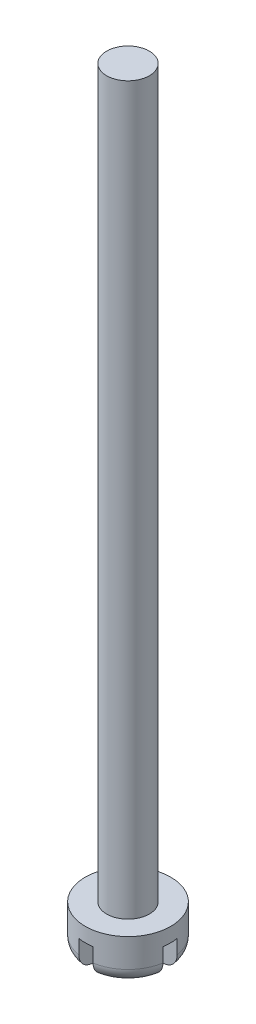
ISO-10303-21;
HEADER;
FILE_DESCRIPTION(('STEP AP214'),'2;1');
FILE_NAME('part.step','',(''),(''),'','','');
FILE_SCHEMA(('AUTOMOTIVE_DESIGN { 1 0 10303 214 1 1 1 1 }'));
ENDSEC;
DATA;
#1=APPLICATION_CONTEXT('core data for automotive mechanical design processes');
#2=APPLICATION_PROTOCOL_DEFINITION('international standard','automotive_design',2000,#1);
#3=PRODUCT_CONTEXT('',#1,'mechanical');
#4=PRODUCT('Part','Part','',(#3));
#5=PRODUCT_RELATED_PRODUCT_CATEGORY('part','',(#4));
#6=PRODUCT_DEFINITION_FORMATION('','',#4);
#7=PRODUCT_DEFINITION_CONTEXT('part definition',#1,'design');
#8=PRODUCT_DEFINITION('design','',#6,#7);
#9=PRODUCT_DEFINITION_SHAPE('','',#8);
#10=(LENGTH_UNIT() NAMED_UNIT(*) SI_UNIT(.MILLI.,.METRE.));
#11=(NAMED_UNIT(*) PLANE_ANGLE_UNIT() SI_UNIT($,.RADIAN.));
#12=(NAMED_UNIT(*) SI_UNIT($,.STERADIAN.) SOLID_ANGLE_UNIT());
#13=UNCERTAINTY_MEASURE_WITH_UNIT(LENGTH_MEASURE(1.E-05),#10,'distance_accuracy_value','');
#14=(GEOMETRIC_REPRESENTATION_CONTEXT(3) GLOBAL_UNCERTAINTY_ASSIGNED_CONTEXT((#13)) GLOBAL_UNIT_ASSIGNED_CONTEXT((#10,
#11,#12)) REPRESENTATION_CONTEXT('',''));
#15=CARTESIAN_POINT('',(0.,0.,0.));
#16=DIRECTION('',(0.,0.,1.));
#17=DIRECTION('',(1.,0.,0.));
#18=AXIS2_PLACEMENT_3D('',#15,#16,#17);
#19=CARTESIAN_POINT('',(-17.0692710791062,0.,10.6565062538066));
#20=DIRECTION('',(0.,-1.,0.));
#21=DIRECTION('',(0.,0.,-1.));
#22=AXIS2_PLACEMENT_3D('',#19,#20,#21);
#23=CYLINDRICAL_SURFACE('',#22,1.5);
#24=DIRECTION('',(0.,-1.,0.));
#25=VECTOR('',#24,1.);
#26=CARTESIAN_POINT('',(-16.8192710791062,-0.5,12.1355261995815));
#27=LINE('',#26,#25);
#28=CARTESIAN_POINT('',(-16.8192710791062,-0.5,12.1355261995815));
#29=VERTEX_POINT('',#28);
#30=CARTESIAN_POINT('',(-16.8192710791062,-1.,12.1355261995815));
#31=VERTEX_POINT('',#30);
#32=EDGE_CURVE('E236',#29,#31,#27,.T.);
#33=ORIENTED_EDGE('',*,*,#32,.T.);
#34=CARTESIAN_POINT('',(-17.0692710791062,-1.,10.6565062538066));
#35=DIRECTION('',(0.,-1.,0.));
#36=DIRECTION('',(0.,0.,-1.));
#37=AXIS2_PLACEMENT_3D('',#34,#35,#36);
#38=CIRCLE('',#37,1.5);
#39=CARTESIAN_POINT('',(-15.5902511333313,-1.,10.9065062538066));
#40=VERTEX_POINT('',#39);
#41=EDGE_CURVE('E288',#31,#40,#38,.F.);
#42=ORIENTED_EDGE('',*,*,#41,.T.);
#43=DIRECTION('',(0.,-1.,0.));
#44=VECTOR('',#43,1.);
#45=CARTESIAN_POINT('',(-15.5902511333313,-0.5,10.9065062538066));
#46=LINE('',#45,#44);
#47=CARTESIAN_POINT('',(-15.5902511333313,-0.5,10.9065062538066));
#48=VERTEX_POINT('',#47);
#49=EDGE_CURVE('E242',#48,#40,#46,.T.);
#50=ORIENTED_EDGE('',*,*,#49,.F.);
#51=CARTESIAN_POINT('',(-17.0692710791062,-0.5,10.6565062538066));
#52=DIRECTION('',(0.,-1.,0.));
#53=DIRECTION('',(0.,0.,-1.));
#54=AXIS2_PLACEMENT_3D('',#51,#52,#53);
#55=CIRCLE('',#54,1.5);
#56=CARTESIAN_POINT('',(-15.5902511333313,-0.5,10.4065062538066));
#57=VERTEX_POINT('',#56);
#58=EDGE_CURVE('E173',#57,#48,#55,.T.);
#59=ORIENTED_EDGE('',*,*,#58,.F.);
#60=DIRECTION('',(0.,-1.,0.));
#61=VECTOR('',#60,1.);
#62=CARTESIAN_POINT('',(-15.5902511333313,-0.5,10.4065062538066));
#63=LINE('',#62,#61);
#64=CARTESIAN_POINT('',(-15.5902511333313,-1.,10.4065062538066));
#65=VERTEX_POINT('',#64);
#66=EDGE_CURVE('E157',#57,#65,#63,.T.);
#67=ORIENTED_EDGE('',*,*,#66,.T.);
#68=CARTESIAN_POINT('',(-17.0692710791062,-1.,10.6565062538066));
#69=DIRECTION('',(0.,-1.,0.));
#70=DIRECTION('',(0.,0.,-1.));
#71=AXIS2_PLACEMENT_3D('',#68,#69,#70);
#72=CIRCLE('',#71,1.5);
#73=CARTESIAN_POINT('',(-16.8192710791062,-1.,9.17748630803172));
#74=VERTEX_POINT('',#73);
#75=EDGE_CURVE('E264',#65,#74,#72,.F.);
#76=ORIENTED_EDGE('',*,*,#75,.T.);
#77=DIRECTION('',(0.,-1.,0.));
#78=VECTOR('',#77,1.);
#79=CARTESIAN_POINT('',(-16.8192710791062,-0.5,9.17748630803172));
#80=LINE('',#79,#78);
#81=CARTESIAN_POINT('',(-16.8192710791062,-0.5,9.17748630803172));
#82=VERTEX_POINT('',#81);
#83=EDGE_CURVE('E215',#82,#74,#80,.T.);
#84=ORIENTED_EDGE('',*,*,#83,.F.);
#85=CARTESIAN_POINT('',(-17.0692710791062,-0.5,10.6565062538066));
#86=DIRECTION('',(0.,-1.,0.));
#87=DIRECTION('',(0.,0.,-1.));
#88=AXIS2_PLACEMENT_3D('',#85,#86,#87);
#89=CIRCLE('',#88,1.5);
#90=CARTESIAN_POINT('',(-17.3192710791062,-0.5,9.17748630803172));
#91=VERTEX_POINT('',#90);
#92=EDGE_CURVE('E158',#91,#82,#89,.T.);
#93=ORIENTED_EDGE('',*,*,#92,.F.);
#94=DIRECTION('',(0.,-1.,0.));
#95=VECTOR('',#94,1.);
#96=CARTESIAN_POINT('',(-17.3192710791062,-0.5,9.17748630803172));
#97=LINE('',#96,#95);
#98=CARTESIAN_POINT('',(-17.3192710791062,-1.,9.17748630803172));
#99=VERTEX_POINT('',#98);
#100=EDGE_CURVE('E218',#91,#99,#97,.T.);
#101=ORIENTED_EDGE('',*,*,#100,.T.);
#102=CARTESIAN_POINT('',(-17.0692710791062,-1.,10.6565062538066));
#103=DIRECTION('',(0.,-1.,0.));
#104=DIRECTION('',(0.,0.,-1.));
#105=AXIS2_PLACEMENT_3D('',#102,#103,#104);
#106=CIRCLE('',#105,1.5);
#107=CARTESIAN_POINT('',(-18.5482910248811,-1.,10.4065062538066));
#108=VERTEX_POINT('',#107);
#109=EDGE_CURVE('E356',#99,#108,#106,.F.);
#110=ORIENTED_EDGE('',*,*,#109,.T.);
#111=DIRECTION('',(0.,-1.,0.));
#112=VECTOR('',#111,1.);
#113=CARTESIAN_POINT('',(-18.5482910248811,-0.5,10.4065062538066));
#114=LINE('',#113,#112);
#115=CARTESIAN_POINT('',(-18.5482910248811,-0.5,10.4065062538066));
#116=VERTEX_POINT('',#115);
#117=EDGE_CURVE('E224',#116,#108,#114,.T.);
#118=ORIENTED_EDGE('',*,*,#117,.F.);
#119=CARTESIAN_POINT('',(-17.0692710791062,-0.5,10.6565062538066));
#120=DIRECTION('',(0.,-1.,0.));
#121=DIRECTION('',(0.,0.,-1.));
#122=AXIS2_PLACEMENT_3D('',#119,#120,#121);
#123=CIRCLE('',#122,1.5);
#124=CARTESIAN_POINT('',(-18.5482910248811,-0.5,10.9065062538066));
#125=VERTEX_POINT('',#124);
#126=EDGE_CURVE('E189',#125,#116,#123,.T.);
#127=ORIENTED_EDGE('',*,*,#126,.F.);
#128=DIRECTION('',(0.,-1.,0.));
#129=VECTOR('',#128,1.);
#130=CARTESIAN_POINT('',(-18.5482910248811,-0.5,10.9065062538066));
#131=LINE('',#130,#129);
#132=CARTESIAN_POINT('',(-18.5482910248811,-1.,10.9065062538066));
#133=VERTEX_POINT('',#132);
#134=EDGE_CURVE('E227',#125,#133,#131,.T.);
#135=ORIENTED_EDGE('',*,*,#134,.T.);
#136=CARTESIAN_POINT('',(-17.0692710791062,-1.,10.6565062538066));
#137=DIRECTION('',(0.,-1.,0.));
#138=DIRECTION('',(0.,0.,-1.));
#139=AXIS2_PLACEMENT_3D('',#136,#137,#138);
#140=CIRCLE('',#139,1.5);
#141=CARTESIAN_POINT('',(-17.3192710791062,-1.,12.1355261995815));
#142=VERTEX_POINT('',#141);
#143=EDGE_CURVE('E358',#133,#142,#140,.F.);
#144=ORIENTED_EDGE('',*,*,#143,.T.);
#145=DIRECTION('',(0.,-1.,0.));
#146=VECTOR('',#145,1.);
#147=CARTESIAN_POINT('',(-17.3192710791062,-0.5,12.1355261995815));
#148=LINE('',#147,#146);
#149=CARTESIAN_POINT('',(-17.3192710791062,-0.5,12.1355261995815));
#150=VERTEX_POINT('',#149);
#151=EDGE_CURVE('E233',#150,#142,#148,.T.);
#152=ORIENTED_EDGE('',*,*,#151,.F.);
#153=CARTESIAN_POINT('',(-17.0692710791062,-0.5,10.6565062538066));
#154=DIRECTION('',(0.,-1.,0.));
#155=DIRECTION('',(0.,0.,-1.));
#156=AXIS2_PLACEMENT_3D('',#153,#154,#155);
#157=CIRCLE('',#156,1.5);
#158=EDGE_CURVE('E181',#29,#150,#157,.T.);
#159=ORIENTED_EDGE('',*,*,#158,.F.);
#160=EDGE_LOOP('',(#33,#42,#50,#59,#67,#76,#84,#93,#101,#110,#118,#127,#135,#144,#152,#159));
#161=FACE_BOUND('',#160,.T.);
#162=CARTESIAN_POINT('',(-17.0692710791062,0.,10.6565062538066));
#163=DIRECTION('',(0.,-1.,0.));
#164=DIRECTION('',(0.,0.,-1.));
#165=AXIS2_PLACEMENT_3D('',#162,#163,#164);
#166=CIRCLE('',#165,1.5);
#167=CARTESIAN_POINT('',(-17.0692710791062,0.,9.15650625380663));
#168=VERTEX_POINT('',#167);
#169=EDGE_CURVE('E248',#168,#168,#166,.T.);
#170=ORIENTED_EDGE('',*,*,#169,.T.);
#171=EDGE_LOOP('',(#170));
#172=FACE_BOUND('',#171,.T.);
#173=ADVANCED_FACE('F32',(#161,#172),#23,.T.);
#174=CARTESIAN_POINT('',(-17.0692710791062,-1.5,10.6565062538066));
#175=DIRECTION('',(0.,-1.,0.));
#176=DIRECTION('',(0.,0.,-1.));
#177=AXIS2_PLACEMENT_3D('',#174,#175,#176);
#178=PLANE('',#177);
#179=DIRECTION('',(0.,0.,-1.));
#180=VECTOR('',#179,1.);
#181=CARTESIAN_POINT('',(-17.3192710791062,-1.5,0.));
#182=LINE('',#181,#180);
#183=CARTESIAN_POINT('',(-17.3192710791062,-1.5,11.6247520903585));
#184=VERTEX_POINT('',#183);
#185=CARTESIAN_POINT('',(-17.3192710791062,-1.5,10.9065062538066));
#186=VERTEX_POINT('',#185);
#187=EDGE_CURVE('E206',#184,#186,#182,.T.);
#188=ORIENTED_EDGE('',*,*,#187,.F.);
#189=CARTESIAN_POINT('',(-17.0692710791062,-1.5,10.6565062538066));
#190=DIRECTION('',(0.,-1.,0.));
#191=DIRECTION('',(0.,0.,-1.));
#192=AXIS2_PLACEMENT_3D('',#189,#190,#191);
#193=CIRCLE('',#192,1.);
#194=CARTESIAN_POINT('',(-18.0375169156581,-1.5,10.9065062538066));
#195=VERTEX_POINT('',#194);
#196=EDGE_CURVE('E287',#184,#195,#193,.T.);
#197=ORIENTED_EDGE('',*,*,#196,.T.);
#198=DIRECTION('',(1.,0.,0.));
#199=VECTOR('',#198,1.);
#200=CARTESIAN_POINT('',(0.,-1.5,10.9065062538066));
#201=LINE('',#200,#199);
#202=EDGE_CURVE('E208',#195,#186,#201,.T.);
#203=ORIENTED_EDGE('',*,*,#202,.T.);
#204=EDGE_LOOP('',(#188,#197,#203));
#205=FACE_BOUND('',#204,.T.);
#206=ADVANCED_FACE('F371',(#205),#178,.T.);
#207=DIRECTION('',(1.,0.,0.));
#208=VECTOR('',#207,1.);
#209=CARTESIAN_POINT('',(0.,-1.5,10.9065062538066));
#210=LINE('',#209,#208);
#211=CARTESIAN_POINT('',(-16.8192710791062,-1.5,10.9065062538066));
#212=VERTEX_POINT('',#211);
#213=CARTESIAN_POINT('',(-16.1010252425543,-1.5,10.9065062538066));
#214=VERTEX_POINT('',#213);
#215=EDGE_CURVE('E201',#212,#214,#210,.T.);
#216=ORIENTED_EDGE('',*,*,#215,.T.);
#217=CARTESIAN_POINT('',(-17.0692710791062,-1.5,10.6565062538066));
#218=DIRECTION('',(0.,-1.,0.));
#219=DIRECTION('',(0.,0.,-1.));
#220=AXIS2_PLACEMENT_3D('',#217,#218,#219);
#221=CIRCLE('',#220,1.);
#222=CARTESIAN_POINT('',(-16.8192710791062,-1.5,11.6247520903585));
#223=VERTEX_POINT('',#222);
#224=EDGE_CURVE('E254',#214,#223,#221,.T.);
#225=ORIENTED_EDGE('',*,*,#224,.T.);
#226=DIRECTION('',(0.,0.,-1.));
#227=VECTOR('',#226,1.);
#228=CARTESIAN_POINT('',(-16.8192710791062,-1.5,0.));
#229=LINE('',#228,#227);
#230=EDGE_CURVE('E204',#223,#212,#229,.T.);
#231=ORIENTED_EDGE('',*,*,#230,.T.);
#232=EDGE_LOOP('',(#216,#225,#231));
#233=FACE_BOUND('',#232,.T.);
#234=ADVANCED_FACE('F363',(#233),#178,.T.);
#235=DIRECTION('',(0.,0.,-1.));
#236=VECTOR('',#235,1.);
#237=CARTESIAN_POINT('',(-16.8192710791062,-1.5,0.));
#238=LINE('',#237,#236);
#239=CARTESIAN_POINT('',(-16.8192710791062,-1.5,10.4065062538066));
#240=VERTEX_POINT('',#239);
#241=CARTESIAN_POINT('',(-16.8192710791062,-1.5,9.68826041725477));
#242=VERTEX_POINT('',#241);
#243=EDGE_CURVE('E152',#240,#242,#238,.T.);
#244=ORIENTED_EDGE('',*,*,#243,.T.);
#245=CARTESIAN_POINT('',(-17.0692710791062,-1.5,10.6565062538066));
#246=DIRECTION('',(0.,-1.,0.));
#247=DIRECTION('',(0.,0.,-1.));
#248=AXIS2_PLACEMENT_3D('',#245,#246,#247);
#249=CIRCLE('',#248,1.);
#250=CARTESIAN_POINT('',(-16.1010252425543,-1.5,10.4065062538066));
#251=VERTEX_POINT('',#250);
#252=EDGE_CURVE('E304',#242,#251,#249,.T.);
#253=ORIENTED_EDGE('',*,*,#252,.T.);
#254=DIRECTION('',(1.,0.,0.));
#255=VECTOR('',#254,1.);
#256=CARTESIAN_POINT('',(0.,-1.5,10.4065062538066));
#257=LINE('',#256,#255);
#258=EDGE_CURVE('E199',#240,#251,#257,.T.);
#259=ORIENTED_EDGE('',*,*,#258,.F.);
#260=EDGE_LOOP('',(#244,#253,#259));
#261=FACE_BOUND('',#260,.T.);
#262=ADVANCED_FACE('F360',(#261),#178,.T.);
#263=CARTESIAN_POINT('',(-17.0692710791062,0.,10.6565062538066));
#264=DIRECTION('',(0.,-1.,0.));
#265=DIRECTION('',(0.,0.,-1.));
#266=AXIS2_PLACEMENT_3D('',#263,#264,#265);
#267=PLANE('',#266);
#268=CARTESIAN_POINT('',(-17.0692710791062,0.,10.6565062538066));
#269=DIRECTION('',(0.,-1.,0.));
#270=DIRECTION('',(0.,0.,-1.));
#271=AXIS2_PLACEMENT_3D('',#268,#269,#270);
#272=CIRCLE('',#271,0.750000000000002);
#273=CARTESIAN_POINT('',(-17.0692710791062,0.,9.90650625380663));
#274=VERTEX_POINT('',#273);
#275=EDGE_CURVE('E251',#274,#274,#272,.F.);
#276=ORIENTED_EDGE('',*,*,#275,.F.);
#277=EDGE_LOOP('',(#276));
#278=FACE_BOUND('',#277,.T.);
#279=ORIENTED_EDGE('',*,*,#169,.F.);
#280=EDGE_LOOP('',(#279));
#281=FACE_BOUND('',#280,.T.);
#282=ADVANCED_FACE('F362',(#278,#281),#267,.F.);
#283=DIRECTION('',(1.,0.,0.));
#284=VECTOR('',#283,1.);
#285=CARTESIAN_POINT('',(0.,-1.5,10.4065062538066));
#286=LINE('',#285,#284);
#287=CARTESIAN_POINT('',(-18.0375169156581,-1.5,10.4065062538066));
#288=VERTEX_POINT('',#287);
#289=CARTESIAN_POINT('',(-17.3192710791062,-1.5,10.4065062538066));
#290=VERTEX_POINT('',#289);
#291=EDGE_CURVE('E211',#288,#290,#286,.T.);
#292=ORIENTED_EDGE('',*,*,#291,.F.);
#293=CARTESIAN_POINT('',(-17.0692710791062,-1.5,10.6565062538066));
#294=DIRECTION('',(0.,-1.,0.));
#295=DIRECTION('',(0.,0.,-1.));
#296=AXIS2_PLACEMENT_3D('',#293,#294,#295);
#297=CIRCLE('',#296,1.);
#298=CARTESIAN_POINT('',(-17.3192710791062,-1.5,9.68826041725477));
#299=VERTEX_POINT('',#298);
#300=EDGE_CURVE('E343',#288,#299,#297,.T.);
#301=ORIENTED_EDGE('',*,*,#300,.T.);
#302=DIRECTION('',(0.,0.,-1.));
#303=VECTOR('',#302,1.);
#304=CARTESIAN_POINT('',(-17.3192710791062,-1.5,0.));
#305=LINE('',#304,#303);
#306=EDGE_CURVE('E169',#290,#299,#305,.T.);
#307=ORIENTED_EDGE('',*,*,#306,.F.);
#308=EDGE_LOOP('',(#292,#301,#307));
#309=FACE_BOUND('',#308,.T.);
#310=ADVANCED_FACE('F364',(#309),#178,.T.);
#311=CARTESIAN_POINT('',(-17.0692710791062,25.5,10.6565062538066));
#312=DIRECTION('',(0.,-1.,0.));
#313=DIRECTION('',(0.,0.,-1.));
#314=AXIS2_PLACEMENT_3D('',#311,#312,#313);
#315=CYLINDRICAL_SURFACE('',#314,0.750000000000002);
#316=CARTESIAN_POINT('',(-17.0692710791062,25.5,10.6565062538066));
#317=DIRECTION('',(0.,1.,0.));
#318=DIRECTION('',(0.,0.,1.));
#319=AXIS2_PLACEMENT_3D('',#316,#317,#318);
#320=CIRCLE('',#319,0.750000000000002);
#321=CARTESIAN_POINT('',(-17.0692710791062,25.5,11.4065062538066));
#322=VERTEX_POINT('',#321);
#323=EDGE_CURVE('E217',#322,#322,#320,.T.);
#324=ORIENTED_EDGE('',*,*,#323,.F.);
#325=EDGE_LOOP('',(#324));
#326=FACE_BOUND('',#325,.T.);
#327=ORIENTED_EDGE('',*,*,#275,.T.);
#328=EDGE_LOOP('',(#327));
#329=FACE_BOUND('',#328,.T.);
#330=ADVANCED_FACE('F374',(#326,#329),#315,.T.);
#331=CARTESIAN_POINT('',(-17.0692710791062,25.5,10.6565062538066));
#332=DIRECTION('',(0.,1.,0.));
#333=DIRECTION('',(0.,0.,1.));
#334=AXIS2_PLACEMENT_3D('',#331,#332,#333);
#335=PLANE('',#334);
#336=ORIENTED_EDGE('',*,*,#323,.T.);
#337=EDGE_LOOP('',(#336));
#338=FACE_BOUND('',#337,.T.);
#339=ADVANCED_FACE('F430',(#338),#335,.T.);
#340=CARTESIAN_POINT('',(-16.8192710791062,-0.5,0.));
#341=DIRECTION('',(-1.,0.,0.));
#342=DIRECTION('',(0.,0.,1.));
#343=AXIS2_PLACEMENT_3D('',#340,#341,#342);
#344=PLANE('',#343);
#345=ORIENTED_EDGE('',*,*,#83,.T.);
#346=CARTESIAN_POINT('',(-16.8192710791062,-1.,9.17748630803172));
#347=CARTESIAN_POINT('',(-16.8192710791062,-1.02781374861587,9.17746133600351));
#348=CARTESIAN_POINT('',(-16.8192710791062,-1.05561878275942,9.17983847976104));
#349=CARTESIAN_POINT('',(-16.8192710791062,-1.11040918462667,9.1892108925483));
#350=CARTESIAN_POINT('',(-16.8192710791062,-1.1373954194116,9.19620108441866));
#351=CARTESIAN_POINT('',(-16.8192710791062,-1.18982056987484,9.21461777101079));
#352=CARTESIAN_POINT('',(-16.8192710791062,-1.21525888685985,9.22604596977785));
#353=CARTESIAN_POINT('',(-16.8192710791062,-1.26386535613692,9.25298906197642));
#354=CARTESIAN_POINT('',(-16.8192710791062,-1.28703370184331,9.26850360681203));
#355=CARTESIAN_POINT('',(-16.8192710791062,-1.33057114447973,9.30324668170601));
#356=CARTESIAN_POINT('',(-16.8192710791062,-1.35092667525741,9.32249220397226));
#357=CARTESIAN_POINT('',(-16.8192710791062,-1.38816977540175,9.36409023933414));
#358=CARTESIAN_POINT('',(-16.8192710791062,-1.40505685896336,9.38644318693436));
#359=CARTESIAN_POINT('',(-16.8192710791062,-1.43513150557888,9.43392757817237));
#360=CARTESIAN_POINT('',(-16.8192710791062,-1.44826694634839,9.45909198573012));
#361=CARTESIAN_POINT('',(-16.8192710791062,-1.47022215105242,9.51123766077089));
#362=CARTESIAN_POINT('',(-16.8192710791062,-1.47904248018834,9.53821868978248));
#363=CARTESIAN_POINT('',(-16.8192710791062,-1.49041247750673,9.58578860221363));
#364=CARTESIAN_POINT('',(-16.8192710791062,-1.49401269448298,9.60613387865773));
#365=CARTESIAN_POINT('',(-16.8192710791062,-1.49880661116601,9.64707171207831));
#366=CARTESIAN_POINT('',(-16.8192710791062,-1.50000434824293,9.66766379559684));
#367=CARTESIAN_POINT('',(-16.8192710791062,-1.5,9.68826041725477));
#368=B_SPLINE_CURVE_WITH_KNOTS('',3,(#346,#347,#348,#349,#350,#351,#352,#353,#354,#355,#356,
#357,#358,#359,#360,#361,#362,#363,#364,#365,#366,#367),.UNSPECIFIED.,.F.,.F.,(4,2,2,2,2,2,2,2,
2,2,4),(0.,0.0833270481001731,0.166562538363734,0.249830019904457,0.33309040040545,
0.416739286173483,0.50039988017215,0.585171778757121,0.669932570785234,0.731781346069536,
0.793526097046583),.UNSPECIFIED.);
#369=EDGE_CURVE('E11',#74,#242,#368,.T.);
#370=ORIENTED_EDGE('',*,*,#369,.T.);
#371=ORIENTED_EDGE('',*,*,#243,.F.);
#372=DIRECTION('',(0.,-1.,0.));
#373=VECTOR('',#372,1.);
#374=CARTESIAN_POINT('',(-16.8192710791062,-0.5,10.4065062538066));
#375=LINE('',#374,#373);
#376=CARTESIAN_POINT('',(-16.8192710791062,-0.5,10.4065062538066));
#377=VERTEX_POINT('',#376);
#378=EDGE_CURVE('E147',#377,#240,#375,.T.);
#379=ORIENTED_EDGE('',*,*,#378,.F.);
#380=DIRECTION('',(0.,0.,-1.));
#381=VECTOR('',#380,1.);
#382=CARTESIAN_POINT('',(-16.8192710791062,-0.5,0.));
#383=LINE('',#382,#381);
#384=EDGE_CURVE('E150',#377,#82,#383,.T.);
#385=ORIENTED_EDGE('',*,*,#384,.T.);
#386=EDGE_LOOP('',(#345,#370,#371,#379,#385));
#387=FACE_BOUND('',#386,.T.);
#388=ADVANCED_FACE('F149',(#387),#344,.T.);
#389=CARTESIAN_POINT('',(-17.3192710791062,-0.5,0.));
#390=DIRECTION('',(-1.,0.,0.));
#391=DIRECTION('',(0.,0.,1.));
#392=AXIS2_PLACEMENT_3D('',#389,#390,#391);
#393=PLANE('',#392);
#394=ORIENTED_EDGE('',*,*,#306,.T.);
#395=CARTESIAN_POINT('',(-17.3192710791062,-1.5,9.68826041725477));
#396=CARTESIAN_POINT('',(-17.3192710791062,-1.50002666200087,9.65897250436663));
#397=CARTESIAN_POINT('',(-17.3192710791062,-1.49758845506674,9.62967764388912));
#398=CARTESIAN_POINT('',(-17.3192710791062,-1.48788360445574,9.57189097864754));
#399=CARTESIAN_POINT('',(-17.3192710791062,-1.48061552591558,9.54339941515062));
#400=CARTESIAN_POINT('',(-17.3192710791062,-1.46134053487843,9.48802077149023));
#401=CARTESIAN_POINT('',(-17.3192710791062,-1.44932782550184,9.46113570053676));
#402=CARTESIAN_POINT('',(-17.3192710791062,-1.42087192496174,9.40983897701042));
#403=CARTESIAN_POINT('',(-17.3192710791062,-1.40443129451288,9.38542590604611));
#404=CARTESIAN_POINT('',(-17.3192710791062,-1.36794604771057,9.34029255444446));
#405=CARTESIAN_POINT('',(-17.3192710791062,-1.34798298041415,9.31950635522899));
#406=CARTESIAN_POINT('',(-17.3192710791062,-1.30478294123163,9.28165524835625));
#407=CARTESIAN_POINT('',(-17.3192710791062,-1.28154528638489,9.26459111888465));
#408=CARTESIAN_POINT('',(-17.3192710791062,-1.2329470389595,9.23501091306684));
#409=CARTESIAN_POINT('',(-17.3192710791062,-1.20763533281553,9.22241437406539));
#410=CARTESIAN_POINT('',(-17.3192710791062,-1.15524769940566,9.20171345161622));
#411=CARTESIAN_POINT('',(-17.3192710791062,-1.12817325689023,9.19360534090705));
#412=CARTESIAN_POINT('',(-17.3192710791062,-1.08407627432165,9.1844126490211));
#413=CARTESIAN_POINT('',(-17.3192710791062,-1.06735425967475,9.18181645317084));
#414=CARTESIAN_POINT('',(-17.3192710791062,-1.03375738887886,9.17835390235473));
#415=CARTESIAN_POINT('',(-17.3192710791062,-1.01688279851855,9.17748496778812));
#416=CARTESIAN_POINT('',(-17.3192710791062,-1.,9.17748630803172));
#417=B_SPLINE_CURVE_WITH_KNOTS('',3,(#395,#396,#397,#398,#399,#400,#401,#402,#403,#404,#405,
#406,#407,#408,#409,#410,#411,#412,#413,#414,#415,#416),.UNSPECIFIED.,.F.,.F.,(4,2,2,2,2,2,2,2,
2,2,4),(0.,0.0877728479485707,0.175571783210265,0.26347832265338,0.351334133549883,
0.437373340804232,0.523430519360222,0.607847980617785,0.692195234723126,0.742880955230151,
0.793490921446687),.UNSPECIFIED.);
#418=EDGE_CURVE('E312',#299,#99,#417,.T.);
#419=ORIENTED_EDGE('',*,*,#418,.T.);
#420=ORIENTED_EDGE('',*,*,#100,.F.);
#421=DIRECTION('',(0.,0.,-1.));
#422=VECTOR('',#421,1.);
#423=CARTESIAN_POINT('',(-17.3192710791062,-0.5,0.));
#424=LINE('',#423,#422);
#425=CARTESIAN_POINT('',(-17.3192710791062,-0.5,10.4065062538066));
#426=VERTEX_POINT('',#425);
#427=EDGE_CURVE('E195',#426,#91,#424,.T.);
#428=ORIENTED_EDGE('',*,*,#427,.F.);
#429=DIRECTION('',(0.,-1.,0.));
#430=VECTOR('',#429,1.);
#431=CARTESIAN_POINT('',(-17.3192710791062,-0.5,10.4065062538066));
#432=LINE('',#431,#430);
#433=EDGE_CURVE('E221',#426,#290,#432,.T.);
#434=ORIENTED_EDGE('',*,*,#433,.T.);
#435=EDGE_LOOP('',(#394,#419,#420,#428,#434));
#436=FACE_BOUND('',#435,.T.);
#437=ADVANCED_FACE('F325',(#436),#393,.F.);
#438=CARTESIAN_POINT('',(0.,-0.5,10.4065062538066));
#439=DIRECTION('',(0.,0.,-1.));
#440=DIRECTION('',(-1.,0.,0.));
#441=AXIS2_PLACEMENT_3D('',#438,#439,#440);
#442=PLANE('',#441);
#443=ORIENTED_EDGE('',*,*,#117,.T.);
#444=CARTESIAN_POINT('',(-18.5482910248811,-1.,10.4065062538066));
#445=CARTESIAN_POINT('',(-18.5483159969093,-1.02781374861587,10.4065062538066));
#446=CARTESIAN_POINT('',(-18.5459388531518,-1.05561878275942,10.4065062538066));
#447=CARTESIAN_POINT('',(-18.5365664403645,-1.11040918462667,10.4065062538066));
#448=CARTESIAN_POINT('',(-18.5295762484942,-1.1373954194116,10.4065062538066));
#449=CARTESIAN_POINT('',(-18.511159561902,-1.18982056987484,10.4065062538066));
#450=CARTESIAN_POINT('',(-18.499731363135,-1.21525888685985,10.4065062538066));
#451=CARTESIAN_POINT('',(-18.4727882709364,-1.26386535613692,10.4065062538066));
#452=CARTESIAN_POINT('',(-18.4572737261008,-1.28703370184331,10.4065062538066));
#453=CARTESIAN_POINT('',(-18.4225306512068,-1.33057114447973,10.4065062538066));
#454=CARTESIAN_POINT('',(-18.4032851289406,-1.35092667525741,10.4065062538066));
#455=CARTESIAN_POINT('',(-18.3616870935787,-1.38816977540175,10.4065062538066));
#456=CARTESIAN_POINT('',(-18.3393341459785,-1.40505685896336,10.4065062538066));
#457=CARTESIAN_POINT('',(-18.2918497547405,-1.43513150557888,10.4065062538066));
#458=CARTESIAN_POINT('',(-18.2666853471827,-1.44826694634839,10.4065062538066));
#459=CARTESIAN_POINT('',(-18.2145396721419,-1.47022215105242,10.4065062538066));
#460=CARTESIAN_POINT('',(-18.1875586431304,-1.47904248018834,10.4065062538066));
#461=CARTESIAN_POINT('',(-18.1399887306992,-1.49041247750673,10.4065062538066));
#462=CARTESIAN_POINT('',(-18.1196434542551,-1.49401269448297,10.4065062538066));
#463=CARTESIAN_POINT('',(-18.0787056208345,-1.49880661116601,10.4065062538066));
#464=CARTESIAN_POINT('',(-18.058113537316,-1.50000434824293,10.4065062538066));
#465=CARTESIAN_POINT('',(-18.0375169156581,-1.5,10.4065062538066));
#466=B_SPLINE_CURVE_WITH_KNOTS('',3,(#444,#445,#446,#447,#448,#449,#450,#451,#452,#453,#454,
#455,#456,#457,#458,#459,#460,#461,#462,#463,#464,#465),.UNSPECIFIED.,.F.,.F.,(4,2,2,2,2,2,2,2,
2,2,4),(0.,0.0833270481001729,0.166562538363734,0.249830019904458,0.333090400405452,
0.416739286173481,0.500399880172148,0.585171778757119,0.669932570785237,0.731781346069534,
0.793526097046581),.UNSPECIFIED.);
#467=EDGE_CURVE('E306',#108,#288,#466,.T.);
#468=ORIENTED_EDGE('',*,*,#467,.T.);
#469=ORIENTED_EDGE('',*,*,#291,.T.);
#470=ORIENTED_EDGE('',*,*,#433,.F.);
#471=DIRECTION('',(1.,0.,0.));
#472=VECTOR('',#471,1.);
#473=CARTESIAN_POINT('',(0.,-0.5,10.4065062538066));
#474=LINE('',#473,#472);
#475=EDGE_CURVE('E192',#116,#426,#474,.T.);
#476=ORIENTED_EDGE('',*,*,#475,.F.);
#477=EDGE_LOOP('',(#443,#468,#469,#470,#476));
#478=FACE_BOUND('',#477,.T.);
#479=ADVANCED_FACE('F320',(#478),#442,.F.);
#480=CARTESIAN_POINT('',(0.,-0.5,10.9065062538066));
#481=DIRECTION('',(0.,0.,-1.));
#482=DIRECTION('',(-1.,0.,0.));
#483=AXIS2_PLACEMENT_3D('',#480,#481,#482);
#484=PLANE('',#483);
#485=ORIENTED_EDGE('',*,*,#202,.F.);
#486=CARTESIAN_POINT('',(-18.0375169156581,-1.5,10.9065062538066));
#487=CARTESIAN_POINT('',(-18.0668048285462,-1.50002666200086,10.9065062538066));
#488=CARTESIAN_POINT('',(-18.0960996890237,-1.49758845506674,10.9065062538066));
#489=CARTESIAN_POINT('',(-18.1538863542653,-1.48788360445574,10.9065062538066));
#490=CARTESIAN_POINT('',(-18.1823779177622,-1.48061552591558,10.9065062538066));
#491=CARTESIAN_POINT('',(-18.2377565614226,-1.46134053487843,10.9065062538066));
#492=CARTESIAN_POINT('',(-18.2646416323761,-1.44932782550184,10.9065062538066));
#493=CARTESIAN_POINT('',(-18.3159383559024,-1.42087192496174,10.9065062538066));
#494=CARTESIAN_POINT('',(-18.3403514268667,-1.40443129451287,10.9065062538066));
#495=CARTESIAN_POINT('',(-18.3854847784684,-1.36794604771057,10.9065062538066));
#496=CARTESIAN_POINT('',(-18.4062709776838,-1.34798298041415,10.9065062538066));
#497=CARTESIAN_POINT('',(-18.4441220845566,-1.30478294123163,10.9065062538066));
#498=CARTESIAN_POINT('',(-18.4611862140282,-1.28154528638489,10.9065062538066));
#499=CARTESIAN_POINT('',(-18.490766419846,-1.2329470389595,10.9065062538066));
#500=CARTESIAN_POINT('',(-18.5033629588474,-1.20763533281552,10.9065062538066));
#501=CARTESIAN_POINT('',(-18.5240638812966,-1.15524769940566,10.9065062538066));
#502=CARTESIAN_POINT('',(-18.5321719920058,-1.12817325689023,10.9065062538066));
#503=CARTESIAN_POINT('',(-18.5413646838917,-1.08407627432165,10.9065062538066));
#504=CARTESIAN_POINT('',(-18.543960879742,-1.06735425967475,10.9065062538066));
#505=CARTESIAN_POINT('',(-18.5474234305581,-1.03375738887886,10.9065062538066));
#506=CARTESIAN_POINT('',(-18.5482923651247,-1.01688279851855,10.9065062538066));
#507=CARTESIAN_POINT('',(-18.5482910248811,-1.,10.9065062538066));
#508=B_SPLINE_CURVE_WITH_KNOTS('',3,(#486,#487,#488,#489,#490,#491,#492,#493,#494,#495,#496,
#497,#498,#499,#500,#501,#502,#503,#504,#505,#506,#507),.UNSPECIFIED.,.F.,.F.,(4,2,2,2,2,2,2,2,
2,2,4),(0.,0.0877728479485725,0.175571783210267,0.263478322653382,0.351334133549884,
0.437373340804233,0.523430519360225,0.607847980617788,0.692195234723128,0.742880955230152,
0.793490921446687),.UNSPECIFIED.);
#509=EDGE_CURVE('E334',#195,#133,#508,.T.);
#510=ORIENTED_EDGE('',*,*,#509,.T.);
#511=ORIENTED_EDGE('',*,*,#134,.F.);
#512=DIRECTION('',(1.,0.,0.));
#513=VECTOR('',#512,1.);
#514=CARTESIAN_POINT('',(0.,-0.5,10.9065062538066));
#515=LINE('',#514,#513);
#516=CARTESIAN_POINT('',(-17.3192710791062,-0.5,10.9065062538066));
#517=VERTEX_POINT('',#516);
#518=EDGE_CURVE('E187',#125,#517,#515,.T.);
#519=ORIENTED_EDGE('',*,*,#518,.T.);
#520=DIRECTION('',(0.,-1.,0.));
#521=VECTOR('',#520,1.);
#522=CARTESIAN_POINT('',(-17.3192710791062,-0.5,10.9065062538066));
#523=LINE('',#522,#521);
#524=EDGE_CURVE('E230',#517,#186,#523,.T.);
#525=ORIENTED_EDGE('',*,*,#524,.T.);
#526=EDGE_LOOP('',(#485,#510,#511,#519,#525));
#527=FACE_BOUND('',#526,.T.);
#528=ADVANCED_FACE('F324',(#527),#484,.T.);
#529=CARTESIAN_POINT('',(-17.3192710791062,-0.5,0.));
#530=DIRECTION('',(-1.,0.,0.));
#531=DIRECTION('',(0.,0.,1.));
#532=AXIS2_PLACEMENT_3D('',#529,#530,#531);
#533=PLANE('',#532);
#534=ORIENTED_EDGE('',*,*,#151,.T.);
#535=CARTESIAN_POINT('',(-17.3192710791062,-1.,12.1355261995815));
#536=CARTESIAN_POINT('',(-17.3192710791062,-1.02781374861587,12.1355511716097));
#537=CARTESIAN_POINT('',(-17.3192710791062,-1.05561878275942,12.1331740278522));
#538=CARTESIAN_POINT('',(-17.3192710791062,-1.11040918462667,12.123801615065));
#539=CARTESIAN_POINT('',(-17.3192710791062,-1.1373954194116,12.1168114231946));
#540=CARTESIAN_POINT('',(-17.3192710791062,-1.18982056987484,12.0983947366025));
#541=CARTESIAN_POINT('',(-17.3192710791062,-1.21525888685985,12.0869665378354));
#542=CARTESIAN_POINT('',(-17.3192710791062,-1.26386535613692,12.0600234456368));
#543=CARTESIAN_POINT('',(-17.3192710791062,-1.28703370184331,12.0445089008012));
#544=CARTESIAN_POINT('',(-17.3192710791062,-1.33057114447973,12.0097658259073));
#545=CARTESIAN_POINT('',(-17.3192710791062,-1.35092667525741,11.990520303641));
#546=CARTESIAN_POINT('',(-17.3192710791062,-1.38816977540175,11.9489222682791));
#547=CARTESIAN_POINT('',(-17.3192710791062,-1.40505685896336,11.9265693206789));
#548=CARTESIAN_POINT('',(-17.3192710791062,-1.43513150557888,11.8790849294409));
#549=CARTESIAN_POINT('',(-17.3192710791062,-1.44826694634839,11.8539205218831));
#550=CARTESIAN_POINT('',(-17.3192710791062,-1.47022215105242,11.8017748468424));
#551=CARTESIAN_POINT('',(-17.3192710791062,-1.47904248018834,11.7747938178308));
#552=CARTESIAN_POINT('',(-17.3192710791062,-1.49041247750673,11.7272239053996));
#553=CARTESIAN_POINT('',(-17.3192710791062,-1.49401269448298,11.7068786289555));
#554=CARTESIAN_POINT('',(-17.3192710791062,-1.49880661116601,11.6659407955349));
#555=CARTESIAN_POINT('',(-17.3192710791062,-1.50000434824293,11.6453487120164));
#556=CARTESIAN_POINT('',(-17.3192710791062,-1.5,11.6247520903585));
#557=B_SPLINE_CURVE_WITH_KNOTS('',3,(#535,#536,#537,#538,#539,#540,#541,#542,#543,#544,#545,
#546,#547,#548,#549,#550,#551,#552,#553,#554,#555,#556),.UNSPECIFIED.,.F.,.F.,(4,2,2,2,2,2,2,2,
2,2,4),(0.,0.0833270481001731,0.166562538363734,0.24983001990446,0.33309040040545,
0.416739286173483,0.50039988017215,0.585171778757121,0.669932570785234,0.731781346069538,
0.793526097046583),.UNSPECIFIED.);
#558=EDGE_CURVE('E339',#142,#184,#557,.T.);
#559=ORIENTED_EDGE('',*,*,#558,.T.);
#560=ORIENTED_EDGE('',*,*,#187,.T.);
#561=ORIENTED_EDGE('',*,*,#524,.F.);
#562=DIRECTION('',(0.,0.,-1.));
#563=VECTOR('',#562,1.);
#564=CARTESIAN_POINT('',(-17.3192710791062,-0.5,0.));
#565=LINE('',#564,#563);
#566=EDGE_CURVE('E184',#150,#517,#565,.T.);
#567=ORIENTED_EDGE('',*,*,#566,.F.);
#568=EDGE_LOOP('',(#534,#559,#560,#561,#567));
#569=FACE_BOUND('',#568,.T.);
#570=ADVANCED_FACE('F331',(#569),#533,.F.);
#571=CARTESIAN_POINT('',(-16.8192710791062,-0.5,0.));
#572=DIRECTION('',(-1.,0.,0.));
#573=DIRECTION('',(0.,0.,1.));
#574=AXIS2_PLACEMENT_3D('',#571,#572,#573);
#575=PLANE('',#574);
#576=ORIENTED_EDGE('',*,*,#230,.F.);
#577=CARTESIAN_POINT('',(-16.8192710791062,-1.5,11.6247520903585));
#578=CARTESIAN_POINT('',(-16.8192710791062,-1.50002666200087,11.6540400032466));
#579=CARTESIAN_POINT('',(-16.8192710791062,-1.49758845506674,11.6833348637241));
#580=CARTESIAN_POINT('',(-16.8192710791062,-1.48788360445574,11.7411215289657));
#581=CARTESIAN_POINT('',(-16.8192710791062,-1.48061552591558,11.7696130924626));
#582=CARTESIAN_POINT('',(-16.8192710791062,-1.46134053487843,11.824991736123));
#583=CARTESIAN_POINT('',(-16.8192710791062,-1.44932782550184,11.8518768070765));
#584=CARTESIAN_POINT('',(-16.8192710791062,-1.42087192496174,11.9031735306028));
#585=CARTESIAN_POINT('',(-16.8192710791062,-1.40443129451288,11.9275866015672));
#586=CARTESIAN_POINT('',(-16.8192710791062,-1.36794604771057,11.9727199531688));
#587=CARTESIAN_POINT('',(-16.8192710791062,-1.34798298041415,11.9935061523843));
#588=CARTESIAN_POINT('',(-16.8192710791062,-1.30478294123163,12.031357259257));
#589=CARTESIAN_POINT('',(-16.8192710791062,-1.28154528638489,12.0484213887286));
#590=CARTESIAN_POINT('',(-16.8192710791062,-1.2329470389595,12.0780015945464));
#591=CARTESIAN_POINT('',(-16.8192710791062,-1.20763533281553,12.0905981335479));
#592=CARTESIAN_POINT('',(-16.8192710791062,-1.15524769940566,12.111299055997));
#593=CARTESIAN_POINT('',(-16.8192710791062,-1.12817325689023,12.1194071667062));
#594=CARTESIAN_POINT('',(-16.8192710791062,-1.08407627432165,12.1285998585922));
#595=CARTESIAN_POINT('',(-16.8192710791062,-1.06735425967475,12.1311960544424));
#596=CARTESIAN_POINT('',(-16.8192710791062,-1.03375738887886,12.1346586052585));
#597=CARTESIAN_POINT('',(-16.8192710791062,-1.01688279851855,12.1355275398251));
#598=CARTESIAN_POINT('',(-16.8192710791062,-1.,12.1355261995815));
#599=B_SPLINE_CURVE_WITH_KNOTS('',3,(#577,#578,#579,#580,#581,#582,#583,#584,#585,#586,#587,
#588,#589,#590,#591,#592,#593,#594,#595,#596,#597,#598),.UNSPECIFIED.,.F.,.F.,(4,2,2,2,2,2,2,2,
2,2,4),(0.,0.0877728479485707,0.175571783210265,0.263478322653383,0.351334133549884,
0.437373340804232,0.523430519360222,0.607847980617785,0.692195234723126,0.742880955230151,
0.793490921446687),.UNSPECIFIED.);
#600=EDGE_CURVE('E257',#223,#31,#599,.T.);
#601=ORIENTED_EDGE('',*,*,#600,.T.);
#602=ORIENTED_EDGE('',*,*,#32,.F.);
#603=DIRECTION('',(0.,0.,-1.));
#604=VECTOR('',#603,1.);
#605=CARTESIAN_POINT('',(-16.8192710791062,-0.5,0.));
#606=LINE('',#605,#604);
#607=CARTESIAN_POINT('',(-16.8192710791062,-0.5,10.9065062538066));
#608=VERTEX_POINT('',#607);
#609=EDGE_CURVE('E179',#29,#608,#606,.T.);
#610=ORIENTED_EDGE('',*,*,#609,.T.);
#611=DIRECTION('',(0.,-1.,0.));
#612=VECTOR('',#611,1.);
#613=CARTESIAN_POINT('',(-16.8192710791062,-0.5,10.9065062538066));
#614=LINE('',#613,#612);
#615=EDGE_CURVE('E239',#608,#212,#614,.T.);
#616=ORIENTED_EDGE('',*,*,#615,.T.);
#617=EDGE_LOOP('',(#576,#601,#602,#610,#616));
#618=FACE_BOUND('',#617,.T.);
#619=ADVANCED_FACE('F266',(#618),#575,.T.);
#620=CARTESIAN_POINT('',(0.,-0.5,10.9065062538066));
#621=DIRECTION('',(0.,0.,-1.));
#622=DIRECTION('',(-1.,0.,0.));
#623=AXIS2_PLACEMENT_3D('',#620,#621,#622);
#624=PLANE('',#623);
#625=ORIENTED_EDGE('',*,*,#49,.T.);
#626=CARTESIAN_POINT('',(-15.5902511333313,-1.,10.9065062538066));
#627=CARTESIAN_POINT('',(-15.5902261613031,-1.02781374861587,10.9065062538066));
#628=CARTESIAN_POINT('',(-15.5926033050606,-1.05561878275942,10.9065062538066));
#629=CARTESIAN_POINT('',(-15.6019757178479,-1.11040918462667,10.9065062538066));
#630=CARTESIAN_POINT('',(-15.6089659097182,-1.1373954194116,10.9065062538066));
#631=CARTESIAN_POINT('',(-15.6273825963104,-1.18982056987484,10.9065062538066));
#632=CARTESIAN_POINT('',(-15.6388107950774,-1.21525888685985,10.9065062538066));
#633=CARTESIAN_POINT('',(-15.665753887276,-1.26386535613692,10.9065062538066));
#634=CARTESIAN_POINT('',(-15.6812684321116,-1.28703370184331,10.9065062538066));
#635=CARTESIAN_POINT('',(-15.7160115070056,-1.33057114447973,10.9065062538066));
#636=CARTESIAN_POINT('',(-15.7352570292718,-1.35092667525741,10.9065062538066));
#637=CARTESIAN_POINT('',(-15.7768550646337,-1.38816977540175,10.9065062538066));
#638=CARTESIAN_POINT('',(-15.7992080122339,-1.40505685896336,10.9065062538066));
#639=CARTESIAN_POINT('',(-15.8466924034719,-1.43513150557888,10.9065062538066));
#640=CARTESIAN_POINT('',(-15.8718568110297,-1.44826694634839,10.9065062538066));
#641=CARTESIAN_POINT('',(-15.9240024860705,-1.47022215105242,10.9065062538066));
#642=CARTESIAN_POINT('',(-15.950983515082,-1.47904248018834,10.9065062538066));
#643=CARTESIAN_POINT('',(-15.9985534275132,-1.49041247750673,10.9065062538066));
#644=CARTESIAN_POINT('',(-16.0188987039573,-1.49401269448297,10.9065062538066));
#645=CARTESIAN_POINT('',(-16.0598365373779,-1.49880661116601,10.9065062538066));
#646=CARTESIAN_POINT('',(-16.0804286208964,-1.50000434824293,10.9065062538066));
#647=CARTESIAN_POINT('',(-16.1010252425543,-1.5,10.9065062538066));
#648=B_SPLINE_CURVE_WITH_KNOTS('',3,(#626,#627,#628,#629,#630,#631,#632,#633,#634,#635,#636,
#637,#638,#639,#640,#641,#642,#643,#644,#645,#646,#647),.UNSPECIFIED.,.F.,.F.,(4,2,2,2,2,2,2,2,
2,2,4),(0.,0.0833270481001727,0.166562538363734,0.249830019904458,0.333090400405449,
0.416739286173481,0.500399880172149,0.585171778757124,0.669932570785238,0.731781346069535,
0.793526097046581),.UNSPECIFIED.);
#649=EDGE_CURVE('E281',#40,#214,#648,.T.);
#650=ORIENTED_EDGE('',*,*,#649,.T.);
#651=ORIENTED_EDGE('',*,*,#215,.F.);
#652=ORIENTED_EDGE('',*,*,#615,.F.);
#653=DIRECTION('',(1.,0.,0.));
#654=VECTOR('',#653,1.);
#655=CARTESIAN_POINT('',(0.,-0.5,10.9065062538066));
#656=LINE('',#655,#654);
#657=EDGE_CURVE('E175',#608,#48,#656,.T.);
#658=ORIENTED_EDGE('',*,*,#657,.T.);
#659=EDGE_LOOP('',(#625,#650,#651,#652,#658));
#660=FACE_BOUND('',#659,.T.);
#661=ADVANCED_FACE('F291',(#660),#624,.T.);
#662=CARTESIAN_POINT('',(0.,-0.5,10.4065062538066));
#663=DIRECTION('',(0.,0.,-1.));
#664=DIRECTION('',(-1.,0.,0.));
#665=AXIS2_PLACEMENT_3D('',#662,#663,#664);
#666=PLANE('',#665);
#667=ORIENTED_EDGE('',*,*,#258,.T.);
#668=CARTESIAN_POINT('',(-16.1010252425543,-1.5,10.4065062538066));
#669=CARTESIAN_POINT('',(-16.0717373296662,-1.50002666200086,10.4065062538066));
#670=CARTESIAN_POINT('',(-16.0424424691887,-1.49758845506674,10.4065062538066));
#671=CARTESIAN_POINT('',(-15.9846558039471,-1.48788360445574,10.4065062538066));
#672=CARTESIAN_POINT('',(-15.9561642404502,-1.48061552591558,10.4065062538066));
#673=CARTESIAN_POINT('',(-15.9007855967898,-1.46134053487843,10.4065062538066));
#674=CARTESIAN_POINT('',(-15.8739005258363,-1.44932782550184,10.4065062538066));
#675=CARTESIAN_POINT('',(-15.82260380231,-1.42087192496174,10.4065062538066));
#676=CARTESIAN_POINT('',(-15.7981907313457,-1.40443129451287,10.4065062538066));
#677=CARTESIAN_POINT('',(-15.753057379744,-1.36794604771057,10.4065062538066));
#678=CARTESIAN_POINT('',(-15.7322711805286,-1.34798298041415,10.4065062538066));
#679=CARTESIAN_POINT('',(-15.6944200736558,-1.30478294123163,10.4065062538066));
#680=CARTESIAN_POINT('',(-15.6773559441842,-1.28154528638489,10.4065062538066));
#681=CARTESIAN_POINT('',(-15.6477757383664,-1.2329470389595,10.4065062538066));
#682=CARTESIAN_POINT('',(-15.635179199365,-1.20763533281552,10.4065062538066));
#683=CARTESIAN_POINT('',(-15.6144782769158,-1.15524769940566,10.4065062538066));
#684=CARTESIAN_POINT('',(-15.6063701662066,-1.12817325689023,10.4065062538066));
#685=CARTESIAN_POINT('',(-15.5971774743207,-1.08407627432165,10.4065062538066));
#686=CARTESIAN_POINT('',(-15.5945812784704,-1.06735425967475,10.4065062538066));
#687=CARTESIAN_POINT('',(-15.5911187276543,-1.03375738887886,10.4065062538066));
#688=CARTESIAN_POINT('',(-15.5902497930877,-1.01688279851855,10.4065062538066));
#689=CARTESIAN_POINT('',(-15.5902511333313,-1.,10.4065062538066));
#690=B_SPLINE_CURVE_WITH_KNOTS('',3,(#668,#669,#670,#671,#672,#673,#674,#675,#676,#677,#678,
#679,#680,#681,#682,#683,#684,#685,#686,#687,#688,#689),.UNSPECIFIED.,.F.,.F.,(4,2,2,2,2,2,2,2,
2,2,4),(0.,0.0877728479485725,0.175571783210267,0.263478322653382,0.351334133549884,
0.437373340804233,0.523430519360225,0.607847980617788,0.692195234723128,0.742880955230151,
0.793490921446687),.UNSPECIFIED.);
#691=EDGE_CURVE('E45',#251,#65,#690,.T.);
#692=ORIENTED_EDGE('',*,*,#691,.T.);
#693=ORIENTED_EDGE('',*,*,#66,.F.);
#694=DIRECTION('',(1.,0.,0.));
#695=VECTOR('',#694,1.);
#696=CARTESIAN_POINT('',(0.,-0.5,10.4065062538066));
#697=LINE('',#696,#695);
#698=EDGE_CURVE('E164',#377,#57,#697,.T.);
#699=ORIENTED_EDGE('',*,*,#698,.F.);
#700=ORIENTED_EDGE('',*,*,#378,.T.);
#701=EDGE_LOOP('',(#667,#692,#693,#699,#700));
#702=FACE_BOUND('',#701,.T.);
#703=ADVANCED_FACE('F171',(#702),#666,.F.);
#704=CARTESIAN_POINT('',(0.,-0.5,0.));
#705=DIRECTION('',(0.,-1.,0.));
#706=DIRECTION('',(0.,0.,-1.));
#707=AXIS2_PLACEMENT_3D('',#704,#705,#706);
#708=PLANE('',#707);
#709=ORIENTED_EDGE('',*,*,#384,.F.);
#710=ORIENTED_EDGE('',*,*,#698,.T.);
#711=ORIENTED_EDGE('',*,*,#58,.T.);
#712=ORIENTED_EDGE('',*,*,#657,.F.);
#713=ORIENTED_EDGE('',*,*,#609,.F.);
#714=ORIENTED_EDGE('',*,*,#158,.T.);
#715=ORIENTED_EDGE('',*,*,#566,.T.);
#716=ORIENTED_EDGE('',*,*,#518,.F.);
#717=ORIENTED_EDGE('',*,*,#126,.T.);
#718=ORIENTED_EDGE('',*,*,#475,.T.);
#719=ORIENTED_EDGE('',*,*,#427,.T.);
#720=ORIENTED_EDGE('',*,*,#92,.T.);
#721=EDGE_LOOP('',(#709,#710,#711,#712,#713,#714,#715,#716,#717,#718,#719,#720));
#722=FACE_BOUND('',#721,.T.);
#723=ADVANCED_FACE('F162',(#722),#708,.T.);
#724=CARTESIAN_POINT('',(-17.0692710791062,-1.,10.6565062538066));
#725=DIRECTION('',(0.,-1.,0.));
#726=DIRECTION('',(0.,0.,-1.));
#727=AXIS2_PLACEMENT_3D('',#724,#725,#726);
#728=TOROIDAL_SURFACE('',#727,1.,0.5);
#729=ORIENTED_EDGE('',*,*,#649,.F.);
#730=ORIENTED_EDGE('',*,*,#41,.F.);
#731=ORIENTED_EDGE('',*,*,#600,.F.);
#732=ORIENTED_EDGE('',*,*,#224,.F.);
#733=EDGE_LOOP('',(#729,#730,#731,#732));
#734=FACE_BOUND('',#733,.T.);
#735=ADVANCED_FACE('F270',(#734),#728,.T.);
#736=CARTESIAN_POINT('',(-17.0692710791062,-1.,10.6565062538066));
#737=DIRECTION('',(0.,-1.,0.));
#738=DIRECTION('',(0.,0.,-1.));
#739=AXIS2_PLACEMENT_3D('',#736,#737,#738);
#740=TOROIDAL_SURFACE('',#739,1.,0.5);
#741=ORIENTED_EDGE('',*,*,#558,.F.);
#742=ORIENTED_EDGE('',*,*,#143,.F.);
#743=ORIENTED_EDGE('',*,*,#509,.F.);
#744=ORIENTED_EDGE('',*,*,#196,.F.);
#745=EDGE_LOOP('',(#741,#742,#743,#744));
#746=FACE_BOUND('',#745,.T.);
#747=ADVANCED_FACE('F275',(#746),#740,.T.);
#748=CARTESIAN_POINT('',(-17.0692710791062,-1.,10.6565062538066));
#749=DIRECTION('',(0.,-1.,0.));
#750=DIRECTION('',(0.,0.,-1.));
#751=AXIS2_PLACEMENT_3D('',#748,#749,#750);
#752=TOROIDAL_SURFACE('',#751,1.,0.5);
#753=ORIENTED_EDGE('',*,*,#467,.F.);
#754=ORIENTED_EDGE('',*,*,#109,.F.);
#755=ORIENTED_EDGE('',*,*,#418,.F.);
#756=ORIENTED_EDGE('',*,*,#300,.F.);
#757=EDGE_LOOP('',(#753,#754,#755,#756));
#758=FACE_BOUND('',#757,.T.);
#759=ADVANCED_FACE('F318',(#758),#752,.T.);
#760=CARTESIAN_POINT('',(-17.0692710791062,-1.,10.6565062538066));
#761=DIRECTION('',(0.,-1.,0.));
#762=DIRECTION('',(0.,0.,-1.));
#763=AXIS2_PLACEMENT_3D('',#760,#761,#762);
#764=TOROIDAL_SURFACE('',#763,1.,0.5);
#765=ORIENTED_EDGE('',*,*,#369,.F.);
#766=ORIENTED_EDGE('',*,*,#75,.F.);
#767=ORIENTED_EDGE('',*,*,#691,.F.);
#768=ORIENTED_EDGE('',*,*,#252,.F.);
#769=EDGE_LOOP('',(#765,#766,#767,#768));
#770=FACE_BOUND('',#769,.T.);
#771=ADVANCED_FACE('F34',(#770),#764,.T.);
#772=CLOSED_SHELL('',(#173,#206,#234,#262,#282,#310,#330,#339,#388,#437,#479,#528,#570,#619,
#661,#703,#723,#735,#747,#759,#771));
#773=MANIFOLD_SOLID_BREP('B2',#772);
#774=ADVANCED_BREP_SHAPE_REPRESENTATION('',(#18,#773),#14);
#775=SHAPE_DEFINITION_REPRESENTATION(#9,#774);
ENDSEC;
END-ISO-10303-21;
